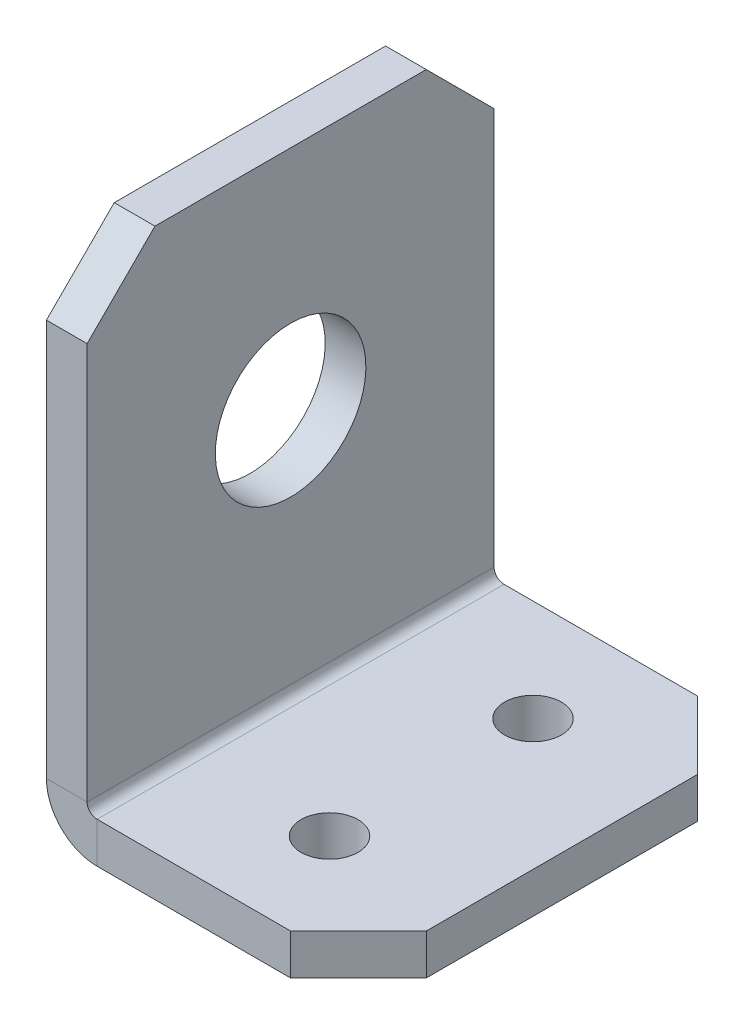
ISO-10303-21;
HEADER;
FILE_DESCRIPTION(('STEP AP214'),'2;1');
FILE_NAME('part.step','',(''),(''),'','','');
FILE_SCHEMA(('AUTOMOTIVE_DESIGN { 1 0 10303 214 1 1 1 1 }'));
ENDSEC;
DATA;
#1=APPLICATION_CONTEXT('core data for automotive mechanical design processes');
#2=APPLICATION_PROTOCOL_DEFINITION('international standard','automotive_design',2000,#1);
#3=PRODUCT_CONTEXT('',#1,'mechanical');
#4=PRODUCT('Part','Part','',(#3));
#5=PRODUCT_RELATED_PRODUCT_CATEGORY('part','',(#4));
#6=PRODUCT_DEFINITION_FORMATION('','',#4);
#7=PRODUCT_DEFINITION_CONTEXT('part definition',#1,'design');
#8=PRODUCT_DEFINITION('design','',#6,#7);
#9=PRODUCT_DEFINITION_SHAPE('','',#8);
#10=(LENGTH_UNIT() NAMED_UNIT(*) SI_UNIT(.MILLI.,.METRE.));
#11=(NAMED_UNIT(*) PLANE_ANGLE_UNIT() SI_UNIT($,.RADIAN.));
#12=(NAMED_UNIT(*) SI_UNIT($,.STERADIAN.) SOLID_ANGLE_UNIT());
#13=UNCERTAINTY_MEASURE_WITH_UNIT(LENGTH_MEASURE(1.E-05),#10,'distance_accuracy_value','');
#14=(GEOMETRIC_REPRESENTATION_CONTEXT(3) GLOBAL_UNCERTAINTY_ASSIGNED_CONTEXT((#13)) GLOBAL_UNIT_ASSIGNED_CONTEXT((#10,
#11,#12)) REPRESENTATION_CONTEXT('',''));
#15=CARTESIAN_POINT('',(0.,0.,0.));
#16=DIRECTION('',(0.,0.,1.));
#17=DIRECTION('',(1.,0.,0.));
#18=AXIS2_PLACEMENT_3D('',#15,#16,#17);
#19=CARTESIAN_POINT('',(-9.2634,-17.5,30.));
#20=DIRECTION('',(0.,0.,1.));
#21=DIRECTION('',(1.,0.,0.));
#22=AXIS2_PLACEMENT_3D('',#19,#20,#21);
#23=PLANE('',#22);
#24=DIRECTION('',(0.,-1.,0.));
#25=VECTOR('',#24,1.);
#26=CARTESIAN_POINT('',(-9.2634,-17.5,30.));
#27=LINE('',#26,#25);
#28=CARTESIAN_POINT('',(-9.2634,-17.5,30.));
#29=VERTEX_POINT('',#28);
#30=CARTESIAN_POINT('',(-9.2634,-20.5,30.));
#31=VERTEX_POINT('',#30);
#32=EDGE_CURVE('E132',#29,#31,#27,.T.);
#33=ORIENTED_EDGE('',*,*,#32,.F.);
#34=CARTESIAN_POINT('',(-9.2634,-16.7634,30.));
#35=DIRECTION('',(0.,0.,-1.));
#36=DIRECTION('',(-1.,0.,0.));
#37=AXIS2_PLACEMENT_3D('',#34,#35,#36);
#38=CIRCLE('',#37,0.7366);
#39=CARTESIAN_POINT('',(-10.,-16.7634,30.));
#40=VERTEX_POINT('',#39);
#41=EDGE_CURVE('E136',#40,#29,#38,.F.);
#42=ORIENTED_EDGE('',*,*,#41,.F.);
#43=DIRECTION('',(1.,0.,0.));
#44=VECTOR('',#43,1.);
#45=CARTESIAN_POINT('',(-13.,-16.7634,30.));
#46=LINE('',#45,#44);
#47=CARTESIAN_POINT('',(-13.,-16.7634,30.));
#48=VERTEX_POINT('',#47);
#49=EDGE_CURVE('E144',#48,#40,#46,.T.);
#50=ORIENTED_EDGE('',*,*,#49,.F.);
#51=CARTESIAN_POINT('',(-9.2634,-16.7634,30.));
#52=DIRECTION('',(0.,0.,1.));
#53=DIRECTION('',(1.,0.,0.));
#54=AXIS2_PLACEMENT_3D('',#51,#52,#53);
#55=CIRCLE('',#54,3.7366);
#56=EDGE_CURVE('E138',#48,#31,#55,.T.);
#57=ORIENTED_EDGE('',*,*,#56,.T.);
#58=EDGE_LOOP('',(#33,#42,#50,#57));
#59=FACE_BOUND('',#58,.T.);
#60=ADVANCED_FACE('F41',(#59),#23,.T.);
#61=CARTESIAN_POINT('',(-13.,-16.7634,30.));
#62=DIRECTION('',(0.,0.,1.));
#63=DIRECTION('',(1.,0.,0.));
#64=AXIS2_PLACEMENT_3D('',#61,#62,#63);
#65=PLANE('',#64);
#66=DIRECTION('',(1.,0.,0.));
#67=VECTOR('',#66,1.);
#68=CARTESIAN_POINT('',(-10.,-20.5,30.));
#69=LINE('',#68,#67);
#70=CARTESIAN_POINT('',(4.99999999999997,-20.5,30.));
#71=VERTEX_POINT('',#70);
#72=EDGE_CURVE('E166',#31,#71,#69,.T.);
#73=ORIENTED_EDGE('',*,*,#72,.T.);
#74=DIRECTION('',(0.,1.,0.));
#75=VECTOR('',#74,1.);
#76=CARTESIAN_POINT('',(4.99999999999997,-16.7634,30.));
#77=LINE('',#76,#75);
#78=CARTESIAN_POINT('',(4.99999999999997,-17.5,30.));
#79=VERTEX_POINT('',#78);
#80=EDGE_CURVE('E165',#71,#79,#77,.T.);
#81=ORIENTED_EDGE('',*,*,#80,.T.);
#82=DIRECTION('',(1.,0.,0.));
#83=VECTOR('',#82,1.);
#84=CARTESIAN_POINT('',(-10.,-17.5,30.));
#85=LINE('',#84,#83);
#86=EDGE_CURVE('E153',#29,#79,#85,.T.);
#87=ORIENTED_EDGE('',*,*,#86,.F.);
#88=ORIENTED_EDGE('',*,*,#32,.T.);
#89=EDGE_LOOP('',(#73,#81,#87,#88));
#90=FACE_BOUND('',#89,.T.);
#91=ADVANCED_FACE('F163',(#90),#65,.T.);
#92=CARTESIAN_POINT('',(-10.,-16.7634,0.));
#93=DIRECTION('',(0.,0.,-1.));
#94=DIRECTION('',(-1.,0.,0.));
#95=AXIS2_PLACEMENT_3D('',#92,#93,#94);
#96=PLANE('',#95);
#97=DIRECTION('',(-1.,0.,0.));
#98=VECTOR('',#97,1.);
#99=CARTESIAN_POINT('',(-10.,-16.7634,0.));
#100=LINE('',#99,#98);
#101=CARTESIAN_POINT('',(-10.,-16.7634,0.));
#102=VERTEX_POINT('',#101);
#103=CARTESIAN_POINT('',(-13.,-16.7634,0.));
#104=VERTEX_POINT('',#103);
#105=EDGE_CURVE('E210',#102,#104,#100,.T.);
#106=ORIENTED_EDGE('',*,*,#105,.F.);
#107=CARTESIAN_POINT('',(-9.2634,-16.7634,0.));
#108=DIRECTION('',(0.,0.,-1.));
#109=DIRECTION('',(-1.,0.,0.));
#110=AXIS2_PLACEMENT_3D('',#107,#108,#109);
#111=CIRCLE('',#110,0.7366);
#112=CARTESIAN_POINT('',(-9.2634,-17.5,0.));
#113=VERTEX_POINT('',#112);
#114=EDGE_CURVE('E185',#102,#113,#111,.F.);
#115=ORIENTED_EDGE('',*,*,#114,.T.);
#116=DIRECTION('',(0.,1.,0.));
#117=VECTOR('',#116,1.);
#118=CARTESIAN_POINT('',(-9.2634,-20.5,0.));
#119=LINE('',#118,#117);
#120=CARTESIAN_POINT('',(-9.2634,-20.5,0.));
#121=VERTEX_POINT('',#120);
#122=EDGE_CURVE('E208',#121,#113,#119,.T.);
#123=ORIENTED_EDGE('',*,*,#122,.F.);
#124=CARTESIAN_POINT('',(-9.2634,-16.7634,0.));
#125=DIRECTION('',(0.,0.,1.));
#126=DIRECTION('',(1.,0.,0.));
#127=AXIS2_PLACEMENT_3D('',#124,#125,#126);
#128=CIRCLE('',#127,3.7366);
#129=EDGE_CURVE('E191',#104,#121,#128,.T.);
#130=ORIENTED_EDGE('',*,*,#129,.F.);
#131=EDGE_LOOP('',(#106,#115,#123,#130));
#132=FACE_BOUND('',#131,.T.);
#133=ADVANCED_FACE('F315',(#132),#96,.T.);
#134=CARTESIAN_POINT('',(-9.2634,-20.5,0.));
#135=DIRECTION('',(0.,0.,-1.));
#136=DIRECTION('',(-1.,0.,0.));
#137=AXIS2_PLACEMENT_3D('',#134,#135,#136);
#138=PLANE('',#137);
#139=DIRECTION('',(0.,-1.,0.));
#140=VECTOR('',#139,1.);
#141=CARTESIAN_POINT('',(-13.,17.5,0.));
#142=LINE('',#141,#140);
#143=CARTESIAN_POINT('',(-13.,12.5,0.));
#144=VERTEX_POINT('',#143);
#145=EDGE_CURVE('E189',#144,#104,#142,.T.);
#146=ORIENTED_EDGE('',*,*,#145,.F.);
#147=DIRECTION('',(1.,0.,0.));
#148=VECTOR('',#147,1.);
#149=CARTESIAN_POINT('',(-9.2634,12.5,0.));
#150=LINE('',#149,#148);
#151=CARTESIAN_POINT('',(-10.,12.5,0.));
#152=VERTEX_POINT('',#151);
#153=EDGE_CURVE('E231',#144,#152,#150,.T.);
#154=ORIENTED_EDGE('',*,*,#153,.T.);
#155=DIRECTION('',(0.,-1.,0.));
#156=VECTOR('',#155,1.);
#157=CARTESIAN_POINT('',(-10.,17.5,0.));
#158=LINE('',#157,#156);
#159=EDGE_CURVE('E187',#152,#102,#158,.T.);
#160=ORIENTED_EDGE('',*,*,#159,.T.);
#161=ORIENTED_EDGE('',*,*,#105,.T.);
#162=EDGE_LOOP('',(#146,#154,#160,#161));
#163=FACE_BOUND('',#162,.T.);
#164=ADVANCED_FACE('F251',(#163),#138,.T.);
#165=CARTESIAN_POINT('',(-10.,-20.5,30.));
#166=DIRECTION('',(0.,1.,0.));
#167=DIRECTION('',(0.,0.,1.));
#168=AXIS2_PLACEMENT_3D('',#165,#166,#167);
#169=PLANE('',#168);
#170=CARTESIAN_POINT('',(0.3683,-20.5,22.5));
#171=DIRECTION('',(0.,1.,0.));
#172=DIRECTION('',(0.,0.,1.));
#173=AXIS2_PLACEMENT_3D('',#170,#171,#172);
#174=CIRCLE('',#173,2.1);
#175=CARTESIAN_POINT('',(0.3683,-20.5,24.6));
#176=VERTEX_POINT('',#175);
#177=EDGE_CURVE('E277',#176,#176,#174,.F.);
#178=ORIENTED_EDGE('',*,*,#177,.F.);
#179=EDGE_LOOP('',(#178));
#180=FACE_BOUND('',#179,.T.);
#181=CARTESIAN_POINT('',(0.3683,-20.5,7.5));
#182=DIRECTION('',(0.,1.,0.));
#183=DIRECTION('',(0.,0.,1.));
#184=AXIS2_PLACEMENT_3D('',#181,#182,#183);
#185=CIRCLE('',#184,2.1);
#186=CARTESIAN_POINT('',(0.3683,-20.5,9.6));
#187=VERTEX_POINT('',#186);
#188=EDGE_CURVE('E278',#187,#187,#185,.F.);
#189=ORIENTED_EDGE('',*,*,#188,.F.);
#190=EDGE_LOOP('',(#189));
#191=FACE_BOUND('',#190,.T.);
#192=DIRECTION('',(1.,0.,0.));
#193=VECTOR('',#192,1.);
#194=CARTESIAN_POINT('',(-10.,-20.5,0.));
#195=LINE('',#194,#193);
#196=CARTESIAN_POINT('',(4.99999999999999,-20.5,0.));
#197=VERTEX_POINT('',#196);
#198=EDGE_CURVE('E180',#121,#197,#195,.T.);
#199=ORIENTED_EDGE('',*,*,#198,.T.);
#200=DIRECTION('',(-0.707106781186547,0.,-0.707106781186549));
#201=VECTOR('',#200,1.);
#202=CARTESIAN_POINT('',(4.99999999999999,-20.5,0.));
#203=LINE('',#202,#201);
#204=CARTESIAN_POINT('',(10.,-20.5,5.00000000000002));
#205=VERTEX_POINT('',#204);
#206=EDGE_CURVE('E219',#197,#205,#203,.F.);
#207=ORIENTED_EDGE('',*,*,#206,.T.);
#208=DIRECTION('',(0.,0.,-1.));
#209=VECTOR('',#208,1.);
#210=CARTESIAN_POINT('',(10.,-20.5,30.));
#211=LINE('',#210,#209);
#212=CARTESIAN_POINT('',(10.,-20.5,25.));
#213=VERTEX_POINT('',#212);
#214=EDGE_CURVE('E205',#213,#205,#211,.T.);
#215=ORIENTED_EDGE('',*,*,#214,.F.);
#216=DIRECTION('',(0.707106781186549,0.,-0.707106781186547));
#217=VECTOR('',#216,1.);
#218=CARTESIAN_POINT('',(10.,-20.5,25.));
#219=LINE('',#218,#217);
#220=EDGE_CURVE('E217',#213,#71,#219,.F.);
#221=ORIENTED_EDGE('',*,*,#220,.T.);
#222=ORIENTED_EDGE('',*,*,#72,.F.);
#223=DIRECTION('',(0.,0.,-1.));
#224=VECTOR('',#223,1.);
#225=CARTESIAN_POINT('',(-9.2634,-20.5,30.));
#226=LINE('',#225,#224);
#227=EDGE_CURVE('E179',#31,#121,#226,.T.);
#228=ORIENTED_EDGE('',*,*,#227,.T.);
#229=EDGE_LOOP('',(#199,#207,#215,#221,#222,#228));
#230=FACE_BOUND('',#229,.T.);
#231=ADVANCED_FACE('F269',(#180,#191,#230),#169,.F.);
#232=CARTESIAN_POINT('',(10.,-17.5,30.));
#233=DIRECTION('',(1.,0.,0.));
#234=DIRECTION('',(0.,0.,-1.));
#235=AXIS2_PLACEMENT_3D('',#232,#233,#234);
#236=PLANE('',#235);
#237=ORIENTED_EDGE('',*,*,#214,.T.);
#238=DIRECTION('',(0.,1.,0.));
#239=VECTOR('',#238,1.);
#240=CARTESIAN_POINT('',(10.,-17.5,5.00000000000002));
#241=LINE('',#240,#239);
#242=CARTESIAN_POINT('',(10.,-17.5,5.00000000000002));
#243=VERTEX_POINT('',#242);
#244=EDGE_CURVE('E224',#205,#243,#241,.T.);
#245=ORIENTED_EDGE('',*,*,#244,.T.);
#246=DIRECTION('',(0.,0.,-1.));
#247=VECTOR('',#246,1.);
#248=CARTESIAN_POINT('',(10.,-17.5,30.));
#249=LINE('',#248,#247);
#250=CARTESIAN_POINT('',(10.,-17.5,25.));
#251=VERTEX_POINT('',#250);
#252=EDGE_CURVE('E160',#251,#243,#249,.T.);
#253=ORIENTED_EDGE('',*,*,#252,.F.);
#254=DIRECTION('',(0.,-1.,0.));
#255=VECTOR('',#254,1.);
#256=CARTESIAN_POINT('',(10.,-17.5,25.));
#257=LINE('',#256,#255);
#258=EDGE_CURVE('E221',#251,#213,#257,.T.);
#259=ORIENTED_EDGE('',*,*,#258,.T.);
#260=EDGE_LOOP('',(#237,#245,#253,#259));
#261=FACE_BOUND('',#260,.T.);
#262=ADVANCED_FACE('F295',(#261),#236,.T.);
#263=CARTESIAN_POINT('',(-10.,-17.5,30.));
#264=DIRECTION('',(0.,1.,0.));
#265=DIRECTION('',(0.,0.,1.));
#266=AXIS2_PLACEMENT_3D('',#263,#264,#265);
#267=PLANE('',#266);
#268=CARTESIAN_POINT('',(0.3683,-17.5,22.5));
#269=DIRECTION('',(0.,1.,0.));
#270=DIRECTION('',(0.,0.,1.));
#271=AXIS2_PLACEMENT_3D('',#268,#269,#270);
#272=CIRCLE('',#271,2.1);
#273=CARTESIAN_POINT('',(0.3683,-17.5,24.6));
#274=VERTEX_POINT('',#273);
#275=EDGE_CURVE('E281',#274,#274,#272,.T.);
#276=ORIENTED_EDGE('',*,*,#275,.F.);
#277=EDGE_LOOP('',(#276));
#278=FACE_BOUND('',#277,.T.);
#279=CARTESIAN_POINT('',(0.3683,-17.5,7.5));
#280=DIRECTION('',(0.,1.,0.));
#281=DIRECTION('',(0.,0.,1.));
#282=AXIS2_PLACEMENT_3D('',#279,#280,#281);
#283=CIRCLE('',#282,2.1);
#284=CARTESIAN_POINT('',(0.3683,-17.5,9.6));
#285=VERTEX_POINT('',#284);
#286=EDGE_CURVE('E282',#285,#285,#283,.T.);
#287=ORIENTED_EDGE('',*,*,#286,.F.);
#288=EDGE_LOOP('',(#287));
#289=FACE_BOUND('',#288,.T.);
#290=ORIENTED_EDGE('',*,*,#252,.T.);
#291=DIRECTION('',(0.707106781186547,0.,0.707106781186549));
#292=VECTOR('',#291,1.);
#293=CARTESIAN_POINT('',(12.5,-17.5,7.50000000000004));
#294=LINE('',#293,#292);
#295=CARTESIAN_POINT('',(4.99999999999999,-17.5,0.));
#296=VERTEX_POINT('',#295);
#297=EDGE_CURVE('E228',#243,#296,#294,.F.);
#298=ORIENTED_EDGE('',*,*,#297,.T.);
#299=DIRECTION('',(1.,0.,0.));
#300=VECTOR('',#299,1.);
#301=CARTESIAN_POINT('',(-10.,-17.5,0.));
#302=LINE('',#301,#300);
#303=EDGE_CURVE('E156',#113,#296,#302,.T.);
#304=ORIENTED_EDGE('',*,*,#303,.F.);
#305=DIRECTION('',(0.,0.,-1.));
#306=VECTOR('',#305,1.);
#307=CARTESIAN_POINT('',(-9.2634,-17.5,30.));
#308=LINE('',#307,#306);
#309=EDGE_CURVE('E150',#29,#113,#308,.T.);
#310=ORIENTED_EDGE('',*,*,#309,.F.);
#311=ORIENTED_EDGE('',*,*,#86,.T.);
#312=DIRECTION('',(-0.707106781186549,0.,0.707106781186547));
#313=VECTOR('',#312,1.);
#314=CARTESIAN_POINT('',(-2.50000000000004,-17.5,37.5));
#315=LINE('',#314,#313);
#316=EDGE_CURVE('E226',#79,#251,#315,.F.);
#317=ORIENTED_EDGE('',*,*,#316,.T.);
#318=EDGE_LOOP('',(#290,#298,#304,#310,#311,#317));
#319=FACE_BOUND('',#318,.T.);
#320=ADVANCED_FACE('F152',(#278,#289,#319),#267,.T.);
#321=CARTESIAN_POINT('',(-9.2634,-16.7634,30.));
#322=DIRECTION('',(0.,0.,-1.));
#323=DIRECTION('',(-1.,0.,0.));
#324=AXIS2_PLACEMENT_3D('',#321,#322,#323);
#325=CYLINDRICAL_SURFACE('',#324,0.7366);
#326=ORIENTED_EDGE('',*,*,#114,.F.);
#327=DIRECTION('',(0.,0.,-1.));
#328=VECTOR('',#327,1.);
#329=CARTESIAN_POINT('',(-10.,-16.7634,30.));
#330=LINE('',#329,#328);
#331=EDGE_CURVE('E161',#40,#102,#330,.T.);
#332=ORIENTED_EDGE('',*,*,#331,.F.);
#333=ORIENTED_EDGE('',*,*,#41,.T.);
#334=ORIENTED_EDGE('',*,*,#309,.T.);
#335=EDGE_LOOP('',(#326,#332,#333,#334));
#336=FACE_BOUND('',#335,.T.);
#337=ADVANCED_FACE('F169',(#336),#325,.F.);
#338=CARTESIAN_POINT('',(-10.,17.5,30.));
#339=DIRECTION('',(1.,0.,0.));
#340=DIRECTION('',(0.,1.,0.));
#341=AXIS2_PLACEMENT_3D('',#338,#339,#340);
#342=PLANE('',#341);
#343=CARTESIAN_POINT('',(-10.,0.75,15.));
#344=DIRECTION('',(1.,0.,0.));
#345=DIRECTION('',(0.,1.,0.));
#346=AXIS2_PLACEMENT_3D('',#343,#344,#345);
#347=CIRCLE('',#346,5.55);
#348=CARTESIAN_POINT('',(-10.,6.3,15.));
#349=VERTEX_POINT('',#348);
#350=EDGE_CURVE('E274',#349,#349,#347,.T.);
#351=ORIENTED_EDGE('',*,*,#350,.F.);
#352=EDGE_LOOP('',(#351));
#353=FACE_BOUND('',#352,.T.);
#354=ORIENTED_EDGE('',*,*,#159,.F.);
#355=DIRECTION('',(0.,-0.707106781186546,-0.707106781186549));
#356=VECTOR('',#355,1.);
#357=CARTESIAN_POINT('',(-10.,30.,17.5000000000001));
#358=LINE('',#357,#356);
#359=CARTESIAN_POINT('',(-10.,17.5,5.00000000000002));
#360=VERTEX_POINT('',#359);
#361=EDGE_CURVE('E236',#152,#360,#358,.F.);
#362=ORIENTED_EDGE('',*,*,#361,.T.);
#363=DIRECTION('',(0.,0.,-1.));
#364=VECTOR('',#363,1.);
#365=CARTESIAN_POINT('',(-10.,17.5,30.));
#366=LINE('',#365,#364);
#367=CARTESIAN_POINT('',(-10.,17.5,25.));
#368=VERTEX_POINT('',#367);
#369=EDGE_CURVE('E201',#368,#360,#366,.T.);
#370=ORIENTED_EDGE('',*,*,#369,.F.);
#371=DIRECTION('',(0.,-0.707106781186549,0.707106781186547));
#372=VECTOR('',#371,1.);
#373=CARTESIAN_POINT('',(-10.,15.,27.5));
#374=LINE('',#373,#372);
#375=CARTESIAN_POINT('',(-10.,12.5,30.));
#376=VERTEX_POINT('',#375);
#377=EDGE_CURVE('E234',#368,#376,#374,.T.);
#378=ORIENTED_EDGE('',*,*,#377,.T.);
#379=DIRECTION('',(0.,-1.,0.));
#380=VECTOR('',#379,1.);
#381=CARTESIAN_POINT('',(-10.,17.5,30.));
#382=LINE('',#381,#380);
#383=EDGE_CURVE('E171',#376,#40,#382,.T.);
#384=ORIENTED_EDGE('',*,*,#383,.T.);
#385=ORIENTED_EDGE('',*,*,#331,.T.);
#386=EDGE_LOOP('',(#354,#362,#370,#378,#384,#385));
#387=FACE_BOUND('',#386,.T.);
#388=ADVANCED_FACE('F257',(#353,#387),#342,.T.);
#389=CARTESIAN_POINT('',(-13.,17.5,30.));
#390=DIRECTION('',(0.,1.,0.));
#391=DIRECTION('',(0.,0.,1.));
#392=AXIS2_PLACEMENT_3D('',#389,#390,#391);
#393=PLANE('',#392);
#394=ORIENTED_EDGE('',*,*,#369,.T.);
#395=DIRECTION('',(-1.,0.,0.));
#396=VECTOR('',#395,1.);
#397=CARTESIAN_POINT('',(-13.,17.5,5.00000000000002));
#398=LINE('',#397,#396);
#399=CARTESIAN_POINT('',(-13.,17.5,5.00000000000002));
#400=VERTEX_POINT('',#399);
#401=EDGE_CURVE('E63',#360,#400,#398,.T.);
#402=ORIENTED_EDGE('',*,*,#401,.T.);
#403=DIRECTION('',(0.,0.,-1.));
#404=VECTOR('',#403,1.);
#405=CARTESIAN_POINT('',(-13.,17.5,30.));
#406=LINE('',#405,#404);
#407=CARTESIAN_POINT('',(-13.,17.5,25.));
#408=VERTEX_POINT('',#407);
#409=EDGE_CURVE('E199',#408,#400,#406,.T.);
#410=ORIENTED_EDGE('',*,*,#409,.F.);
#411=DIRECTION('',(1.,0.,0.));
#412=VECTOR('',#411,1.);
#413=CARTESIAN_POINT('',(-10.,17.5,25.));
#414=LINE('',#413,#412);
#415=EDGE_CURVE('E238',#408,#368,#414,.T.);
#416=ORIENTED_EDGE('',*,*,#415,.T.);
#417=EDGE_LOOP('',(#394,#402,#410,#416));
#418=FACE_BOUND('',#417,.T.);
#419=ADVANCED_FACE('F258',(#418),#393,.T.);
#420=CARTESIAN_POINT('',(-13.,17.5,30.));
#421=DIRECTION('',(1.,0.,0.));
#422=DIRECTION('',(0.,1.,0.));
#423=AXIS2_PLACEMENT_3D('',#420,#421,#422);
#424=PLANE('',#423);
#425=CARTESIAN_POINT('',(-13.,0.75,15.));
#426=DIRECTION('',(1.,0.,0.));
#427=DIRECTION('',(0.,1.,0.));
#428=AXIS2_PLACEMENT_3D('',#425,#426,#427);
#429=CIRCLE('',#428,5.55);
#430=CARTESIAN_POINT('',(-13.,6.3,15.));
#431=VERTEX_POINT('',#430);
#432=EDGE_CURVE('E183',#431,#431,#429,.F.);
#433=ORIENTED_EDGE('',*,*,#432,.F.);
#434=EDGE_LOOP('',(#433));
#435=FACE_BOUND('',#434,.T.);
#436=ORIENTED_EDGE('',*,*,#409,.T.);
#437=DIRECTION('',(0.,0.707106781186546,0.707106781186549));
#438=VECTOR('',#437,1.);
#439=CARTESIAN_POINT('',(-13.,12.5,0.));
#440=LINE('',#439,#438);
#441=EDGE_CURVE('E50',#400,#144,#440,.F.);
#442=ORIENTED_EDGE('',*,*,#441,.T.);
#443=ORIENTED_EDGE('',*,*,#145,.T.);
#444=DIRECTION('',(0.,0.,-1.));
#445=VECTOR('',#444,1.);
#446=CARTESIAN_POINT('',(-13.,-16.7634,30.));
#447=LINE('',#446,#445);
#448=EDGE_CURVE('E196',#48,#104,#447,.T.);
#449=ORIENTED_EDGE('',*,*,#448,.F.);
#450=DIRECTION('',(0.,-1.,0.));
#451=VECTOR('',#450,1.);
#452=CARTESIAN_POINT('',(-13.,17.5,30.));
#453=LINE('',#452,#451);
#454=CARTESIAN_POINT('',(-13.,12.5,30.));
#455=VERTEX_POINT('',#454);
#456=EDGE_CURVE('E173',#455,#48,#453,.T.);
#457=ORIENTED_EDGE('',*,*,#456,.F.);
#458=DIRECTION('',(0.,0.707106781186549,-0.707106781186547));
#459=VECTOR('',#458,1.);
#460=CARTESIAN_POINT('',(-13.,17.5,25.));
#461=LINE('',#460,#459);
#462=EDGE_CURVE('E242',#455,#408,#461,.T.);
#463=ORIENTED_EDGE('',*,*,#462,.T.);
#464=EDGE_LOOP('',(#436,#442,#443,#449,#457,#463));
#465=FACE_BOUND('',#464,.T.);
#466=ADVANCED_FACE('F246',(#435,#465),#424,.F.);
#467=CARTESIAN_POINT('',(-9.2634,-16.7634,30.));
#468=DIRECTION('',(0.,0.,-1.));
#469=DIRECTION('',(-1.,0.,0.));
#470=AXIS2_PLACEMENT_3D('',#467,#468,#469);
#471=CYLINDRICAL_SURFACE('',#470,3.7366);
#472=ORIENTED_EDGE('',*,*,#129,.T.);
#473=ORIENTED_EDGE('',*,*,#227,.F.);
#474=ORIENTED_EDGE('',*,*,#56,.F.);
#475=ORIENTED_EDGE('',*,*,#448,.T.);
#476=EDGE_LOOP('',(#472,#473,#474,#475));
#477=FACE_BOUND('',#476,.T.);
#478=ADVANCED_FACE('F265',(#477),#471,.T.);
#479=CARTESIAN_POINT('',(-9.2634,-16.7634,30.));
#480=DIRECTION('',(0.,0.,-1.));
#481=DIRECTION('',(-1.,0.,0.));
#482=AXIS2_PLACEMENT_3D('',#479,#480,#481);
#483=PLANE('',#482);
#484=ORIENTED_EDGE('',*,*,#383,.F.);
#485=DIRECTION('',(-1.,0.,0.));
#486=VECTOR('',#485,1.);
#487=CARTESIAN_POINT('',(-13.,12.5,30.));
#488=LINE('',#487,#486);
#489=EDGE_CURVE('E11',#376,#455,#488,.T.);
#490=ORIENTED_EDGE('',*,*,#489,.T.);
#491=ORIENTED_EDGE('',*,*,#456,.T.);
#492=ORIENTED_EDGE('',*,*,#49,.T.);
#493=EDGE_LOOP('',(#484,#490,#491,#492));
#494=FACE_BOUND('',#493,.T.);
#495=ADVANCED_FACE('F262',(#494),#483,.F.);
#496=CARTESIAN_POINT('',(-9.2634,-16.7634,0.));
#497=DIRECTION('',(0.,0.,-1.));
#498=DIRECTION('',(-1.,0.,0.));
#499=AXIS2_PLACEMENT_3D('',#496,#497,#498);
#500=PLANE('',#499);
#501=ORIENTED_EDGE('',*,*,#303,.T.);
#502=DIRECTION('',(0.,-1.,0.));
#503=VECTOR('',#502,1.);
#504=CARTESIAN_POINT('',(4.99999999999999,-16.7634,0.));
#505=LINE('',#504,#503);
#506=EDGE_CURVE('E143',#296,#197,#505,.T.);
#507=ORIENTED_EDGE('',*,*,#506,.T.);
#508=ORIENTED_EDGE('',*,*,#198,.F.);
#509=ORIENTED_EDGE('',*,*,#122,.T.);
#510=EDGE_LOOP('',(#501,#507,#508,#509));
#511=FACE_BOUND('',#510,.T.);
#512=ADVANCED_FACE('F371',(#511),#500,.T.);
#513=CARTESIAN_POINT('',(-13.001,0.75,15.));
#514=DIRECTION('',(1.,0.,0.));
#515=DIRECTION('',(0.,1.,0.));
#516=AXIS2_PLACEMENT_3D('',#513,#514,#515);
#517=CYLINDRICAL_SURFACE('',#516,5.55);
#518=ORIENTED_EDGE('',*,*,#350,.T.);
#519=EDGE_LOOP('',(#518));
#520=FACE_BOUND('',#519,.T.);
#521=ORIENTED_EDGE('',*,*,#432,.T.);
#522=EDGE_LOOP('',(#521));
#523=FACE_BOUND('',#522,.T.);
#524=ADVANCED_FACE('F302',(#520,#523),#517,.F.);
#525=CARTESIAN_POINT('',(0.3683,-20.501,7.5));
#526=DIRECTION('',(0.,1.,0.));
#527=DIRECTION('',(0.,0.,1.));
#528=AXIS2_PLACEMENT_3D('',#525,#526,#527);
#529=CYLINDRICAL_SURFACE('',#528,2.1);
#530=CARTESIAN_POINT('',(0.3683,-17.5,9.6));
#531=CARTESIAN_POINT('',(0.3683,-17.53125,9.6));
#532=CARTESIAN_POINT('',(0.3683,-17.5625,9.6));
#533=CARTESIAN_POINT('',(0.3683,-17.625,9.6));
#534=CARTESIAN_POINT('',(0.3683,-17.65625,9.6));
#535=CARTESIAN_POINT('',(0.3683,-17.71875,9.6));
#536=CARTESIAN_POINT('',(0.3683,-17.75,9.6));
#537=CARTESIAN_POINT('',(0.3683,-17.8125,9.6));
#538=CARTESIAN_POINT('',(0.3683,-17.84375,9.6));
#539=CARTESIAN_POINT('',(0.3683,-17.90625,9.6));
#540=CARTESIAN_POINT('',(0.3683,-17.9375,9.6));
#541=CARTESIAN_POINT('',(0.3683,-18.,9.6));
#542=CARTESIAN_POINT('',(0.3683,-18.03125,9.6));
#543=CARTESIAN_POINT('',(0.3683,-18.09375,9.6));
#544=CARTESIAN_POINT('',(0.3683,-18.125,9.6));
#545=CARTESIAN_POINT('',(0.3683,-18.1875,9.6));
#546=CARTESIAN_POINT('',(0.3683,-18.21875,9.6));
#547=CARTESIAN_POINT('',(0.3683,-18.28125,9.6));
#548=CARTESIAN_POINT('',(0.3683,-18.3125,9.6));
#549=CARTESIAN_POINT('',(0.3683,-18.375,9.6));
#550=CARTESIAN_POINT('',(0.3683,-18.40625,9.6));
#551=CARTESIAN_POINT('',(0.3683,-18.46875,9.6));
#552=CARTESIAN_POINT('',(0.3683,-18.5,9.6));
#553=CARTESIAN_POINT('',(0.3683,-18.5625,9.6));
#554=CARTESIAN_POINT('',(0.3683,-18.59375,9.6));
#555=CARTESIAN_POINT('',(0.3683,-18.65625,9.6));
#556=CARTESIAN_POINT('',(0.3683,-18.6875,9.6));
#557=CARTESIAN_POINT('',(0.3683,-18.75,9.6));
#558=CARTESIAN_POINT('',(0.3683,-18.78125,9.6));
#559=CARTESIAN_POINT('',(0.3683,-18.84375,9.6));
#560=CARTESIAN_POINT('',(0.3683,-18.875,9.6));
#561=CARTESIAN_POINT('',(0.3683,-18.9375,9.6));
#562=CARTESIAN_POINT('',(0.3683,-18.96875,9.6));
#563=CARTESIAN_POINT('',(0.3683,-19.03125,9.6));
#564=CARTESIAN_POINT('',(0.3683,-19.0625,9.6));
#565=CARTESIAN_POINT('',(0.3683,-19.125,9.6));
#566=CARTESIAN_POINT('',(0.3683,-19.15625,9.6));
#567=CARTESIAN_POINT('',(0.3683,-19.21875,9.6));
#568=CARTESIAN_POINT('',(0.3683,-19.25,9.6));
#569=CARTESIAN_POINT('',(0.3683,-19.3125,9.6));
#570=CARTESIAN_POINT('',(0.3683,-19.34375,9.6));
#571=CARTESIAN_POINT('',(0.3683,-19.40625,9.6));
#572=CARTESIAN_POINT('',(0.3683,-19.4375,9.6));
#573=CARTESIAN_POINT('',(0.3683,-19.5,9.6));
#574=CARTESIAN_POINT('',(0.3683,-19.53125,9.6));
#575=CARTESIAN_POINT('',(0.3683,-19.59375,9.6));
#576=CARTESIAN_POINT('',(0.3683,-19.625,9.6));
#577=CARTESIAN_POINT('',(0.3683,-19.6875,9.6));
#578=CARTESIAN_POINT('',(0.3683,-19.71875,9.6));
#579=CARTESIAN_POINT('',(0.3683,-19.78125,9.6));
#580=CARTESIAN_POINT('',(0.3683,-19.8125,9.6));
#581=CARTESIAN_POINT('',(0.3683,-19.875,9.6));
#582=CARTESIAN_POINT('',(0.3683,-19.90625,9.6));
#583=CARTESIAN_POINT('',(0.3683,-19.96875,9.6));
#584=CARTESIAN_POINT('',(0.3683,-20.,9.6));
#585=CARTESIAN_POINT('',(0.3683,-20.0625,9.6));
#586=CARTESIAN_POINT('',(0.3683,-20.09375,9.6));
#587=CARTESIAN_POINT('',(0.3683,-20.15625,9.6));
#588=CARTESIAN_POINT('',(0.3683,-20.1875,9.6));
#589=CARTESIAN_POINT('',(0.3683,-20.25,9.6));
#590=CARTESIAN_POINT('',(0.3683,-20.28125,9.6));
#591=CARTESIAN_POINT('',(0.3683,-20.34375,9.6));
#592=CARTESIAN_POINT('',(0.3683,-20.375,9.6));
#593=CARTESIAN_POINT('',(0.3683,-20.4375,9.6));
#594=CARTESIAN_POINT('',(0.3683,-20.46875,9.6));
#595=CARTESIAN_POINT('',(0.3683,-20.5,9.6));
#596=B_SPLINE_CURVE_WITH_KNOTS('',3,(#530,#531,#532,#533,#534,#535,#536,#537,#538,#539,#540,
#541,#542,#543,#544,#545,#546,#547,#548,#549,#550,#551,#552,#553,#554,#555,#556,#557,#558,#559,
#560,#561,#562,#563,#564,#565,#566,#567,#568,#569,#570,#571,#572,#573,#574,#575,#576,#577,#578,
#579,#580,#581,#582,#583,#584,#585,#586,#587,#588,#589,#590,#591,#592,#593,#594,#595),
.UNSPECIFIED.,.F.,.F.,(4,2,2,2,2,2,2,2,2,2,2,2,2,2,2,2,2,2,2,2,2,2,2,2,2,2,2,2,2,2,2,2,4),(0.,
0.0937500000000001,0.1875,0.28125,0.374999999999997,0.46875,0.562499999999997,0.656249999999997,
0.749999999999997,0.843749999999997,0.937499999999997,1.03125,1.125,1.21875,1.3125,1.40625,1.5,
1.59375,1.6875,1.78125,1.875,1.96875,2.0625,2.15625,2.25,2.34375,2.4375,2.53125,2.625,2.71875,
2.8125,2.90625,3.),.UNSPECIFIED.);
#597=EDGE_CURVE('BSEAM299',#285,#187,#596,.T.);
#598=ORIENTED_EDGE('',*,*,#286,.T.);
#599=ORIENTED_EDGE('',*,*,#188,.T.);
#600=ORIENTED_EDGE('',*,*,#597,.T.);
#601=ORIENTED_EDGE('',*,*,#597,.F.);
#602=EDGE_LOOP('',(#598,#600,#599,#601));
#603=FACE_BOUND('',#602,.T.);
#604=ADVANCED_FACE('F299',(#603),#529,.F.);
#605=CARTESIAN_POINT('',(0.3683,-20.501,22.5));
#606=DIRECTION('',(0.,1.,0.));
#607=DIRECTION('',(0.,0.,1.));
#608=AXIS2_PLACEMENT_3D('',#605,#606,#607);
#609=CYLINDRICAL_SURFACE('',#608,2.1);
#610=CARTESIAN_POINT('',(0.3683,-17.5,24.6));
#611=CARTESIAN_POINT('',(0.3683,-17.53125,24.6));
#612=CARTESIAN_POINT('',(0.3683,-17.5625,24.6));
#613=CARTESIAN_POINT('',(0.3683,-17.625,24.6));
#614=CARTESIAN_POINT('',(0.3683,-17.65625,24.6));
#615=CARTESIAN_POINT('',(0.3683,-17.71875,24.6));
#616=CARTESIAN_POINT('',(0.3683,-17.75,24.6));
#617=CARTESIAN_POINT('',(0.3683,-17.8125,24.6));
#618=CARTESIAN_POINT('',(0.3683,-17.84375,24.6));
#619=CARTESIAN_POINT('',(0.3683,-17.90625,24.6));
#620=CARTESIAN_POINT('',(0.3683,-17.9375,24.6));
#621=CARTESIAN_POINT('',(0.3683,-18.,24.6));
#622=CARTESIAN_POINT('',(0.3683,-18.03125,24.6));
#623=CARTESIAN_POINT('',(0.3683,-18.09375,24.6));
#624=CARTESIAN_POINT('',(0.3683,-18.125,24.6));
#625=CARTESIAN_POINT('',(0.3683,-18.1875,24.6));
#626=CARTESIAN_POINT('',(0.3683,-18.21875,24.6));
#627=CARTESIAN_POINT('',(0.3683,-18.28125,24.6));
#628=CARTESIAN_POINT('',(0.3683,-18.3125,24.6));
#629=CARTESIAN_POINT('',(0.3683,-18.375,24.6));
#630=CARTESIAN_POINT('',(0.3683,-18.40625,24.6));
#631=CARTESIAN_POINT('',(0.3683,-18.46875,24.6));
#632=CARTESIAN_POINT('',(0.3683,-18.5,24.6));
#633=CARTESIAN_POINT('',(0.3683,-18.5625,24.6));
#634=CARTESIAN_POINT('',(0.3683,-18.59375,24.6));
#635=CARTESIAN_POINT('',(0.3683,-18.65625,24.6));
#636=CARTESIAN_POINT('',(0.3683,-18.6875,24.6));
#637=CARTESIAN_POINT('',(0.3683,-18.75,24.6));
#638=CARTESIAN_POINT('',(0.3683,-18.78125,24.6));
#639=CARTESIAN_POINT('',(0.3683,-18.84375,24.6));
#640=CARTESIAN_POINT('',(0.3683,-18.875,24.6));
#641=CARTESIAN_POINT('',(0.3683,-18.9375,24.6));
#642=CARTESIAN_POINT('',(0.3683,-18.96875,24.6));
#643=CARTESIAN_POINT('',(0.3683,-19.03125,24.6));
#644=CARTESIAN_POINT('',(0.3683,-19.0625,24.6));
#645=CARTESIAN_POINT('',(0.3683,-19.125,24.6));
#646=CARTESIAN_POINT('',(0.3683,-19.15625,24.6));
#647=CARTESIAN_POINT('',(0.3683,-19.21875,24.6));
#648=CARTESIAN_POINT('',(0.3683,-19.25,24.6));
#649=CARTESIAN_POINT('',(0.3683,-19.3125,24.6));
#650=CARTESIAN_POINT('',(0.3683,-19.34375,24.6));
#651=CARTESIAN_POINT('',(0.3683,-19.40625,24.6));
#652=CARTESIAN_POINT('',(0.3683,-19.4375,24.6));
#653=CARTESIAN_POINT('',(0.3683,-19.5,24.6));
#654=CARTESIAN_POINT('',(0.3683,-19.53125,24.6));
#655=CARTESIAN_POINT('',(0.3683,-19.59375,24.6));
#656=CARTESIAN_POINT('',(0.3683,-19.625,24.6));
#657=CARTESIAN_POINT('',(0.3683,-19.6875,24.6));
#658=CARTESIAN_POINT('',(0.3683,-19.71875,24.6));
#659=CARTESIAN_POINT('',(0.3683,-19.78125,24.6));
#660=CARTESIAN_POINT('',(0.3683,-19.8125,24.6));
#661=CARTESIAN_POINT('',(0.3683,-19.875,24.6));
#662=CARTESIAN_POINT('',(0.3683,-19.90625,24.6));
#663=CARTESIAN_POINT('',(0.3683,-19.96875,24.6));
#664=CARTESIAN_POINT('',(0.3683,-20.,24.6));
#665=CARTESIAN_POINT('',(0.3683,-20.0625,24.6));
#666=CARTESIAN_POINT('',(0.3683,-20.09375,24.6));
#667=CARTESIAN_POINT('',(0.3683,-20.15625,24.6));
#668=CARTESIAN_POINT('',(0.3683,-20.1875,24.6));
#669=CARTESIAN_POINT('',(0.3683,-20.25,24.6));
#670=CARTESIAN_POINT('',(0.3683,-20.28125,24.6));
#671=CARTESIAN_POINT('',(0.3683,-20.34375,24.6));
#672=CARTESIAN_POINT('',(0.3683,-20.375,24.6));
#673=CARTESIAN_POINT('',(0.3683,-20.4375,24.6));
#674=CARTESIAN_POINT('',(0.3683,-20.46875,24.6));
#675=CARTESIAN_POINT('',(0.3683,-20.5,24.6));
#676=B_SPLINE_CURVE_WITH_KNOTS('',3,(#610,#611,#612,#613,#614,#615,#616,#617,#618,#619,#620,
#621,#622,#623,#624,#625,#626,#627,#628,#629,#630,#631,#632,#633,#634,#635,#636,#637,#638,#639,
#640,#641,#642,#643,#644,#645,#646,#647,#648,#649,#650,#651,#652,#653,#654,#655,#656,#657,#658,
#659,#660,#661,#662,#663,#664,#665,#666,#667,#668,#669,#670,#671,#672,#673,#674,#675),
.UNSPECIFIED.,.F.,.F.,(4,2,2,2,2,2,2,2,2,2,2,2,2,2,2,2,2,2,2,2,2,2,2,2,2,2,2,2,2,2,2,2,4),(0.,
0.0937500000000001,0.1875,0.28125,0.374999999999997,0.46875,0.562499999999997,0.656249999999997,
0.749999999999997,0.843749999999997,0.937499999999997,1.03125,1.125,1.21875,1.3125,1.40625,1.5,
1.59375,1.6875,1.78125,1.875,1.96875,2.0625,2.15625,2.25,2.34375,2.4375,2.53125,2.625,2.71875,
2.8125,2.90625,3.),.UNSPECIFIED.);
#677=EDGE_CURVE('BSEAM290',#274,#176,#676,.T.);
#678=ORIENTED_EDGE('',*,*,#275,.T.);
#679=ORIENTED_EDGE('',*,*,#177,.T.);
#680=ORIENTED_EDGE('',*,*,#677,.T.);
#681=ORIENTED_EDGE('',*,*,#677,.F.);
#682=EDGE_LOOP('',(#678,#680,#679,#681));
#683=FACE_BOUND('',#682,.T.);
#684=ADVANCED_FACE('F290',(#683),#609,.F.);
#685=CARTESIAN_POINT('',(4.99999999999999,-16.7634,0.));
#686=DIRECTION('',(-0.707106781186549,0.,0.707106781186547));
#687=DIRECTION('',(0.,-1.,0.));
#688=AXIS2_PLACEMENT_3D('',#685,#686,#687);
#689=PLANE('',#688);
#690=ORIENTED_EDGE('',*,*,#297,.F.);
#691=ORIENTED_EDGE('',*,*,#244,.F.);
#692=ORIENTED_EDGE('',*,*,#206,.F.);
#693=ORIENTED_EDGE('',*,*,#506,.F.);
#694=EDGE_LOOP('',(#690,#691,#692,#693));
#695=FACE_BOUND('',#694,.T.);
#696=ADVANCED_FACE('F327',(#695),#689,.F.);
#697=CARTESIAN_POINT('',(10.,-17.5,25.));
#698=DIRECTION('',(-0.707106781186547,0.,-0.707106781186549));
#699=DIRECTION('',(0.,-1.,0.));
#700=AXIS2_PLACEMENT_3D('',#697,#698,#699);
#701=PLANE('',#700);
#702=ORIENTED_EDGE('',*,*,#316,.F.);
#703=ORIENTED_EDGE('',*,*,#80,.F.);
#704=ORIENTED_EDGE('',*,*,#220,.F.);
#705=ORIENTED_EDGE('',*,*,#258,.F.);
#706=EDGE_LOOP('',(#702,#703,#704,#705));
#707=FACE_BOUND('',#706,.T.);
#708=ADVANCED_FACE('F333',(#707),#701,.F.);
#709=CARTESIAN_POINT('',(-9.2634,12.5,0.));
#710=DIRECTION('',(0.,-0.707106781186549,0.707106781186546));
#711=DIRECTION('',(1.,0.,0.));
#712=AXIS2_PLACEMENT_3D('',#709,#710,#711);
#713=PLANE('',#712);
#714=ORIENTED_EDGE('',*,*,#441,.F.);
#715=ORIENTED_EDGE('',*,*,#401,.F.);
#716=ORIENTED_EDGE('',*,*,#361,.F.);
#717=ORIENTED_EDGE('',*,*,#153,.F.);
#718=EDGE_LOOP('',(#714,#715,#716,#717));
#719=FACE_BOUND('',#718,.T.);
#720=ADVANCED_FACE('F254',(#719),#713,.F.);
#721=CARTESIAN_POINT('',(-13.,17.5,25.));
#722=DIRECTION('',(0.,0.707106781186547,0.707106781186549));
#723=DIRECTION('',(-1.,0.,0.));
#724=AXIS2_PLACEMENT_3D('',#721,#722,#723);
#725=PLANE('',#724);
#726=ORIENTED_EDGE('',*,*,#462,.F.);
#727=ORIENTED_EDGE('',*,*,#489,.F.);
#728=ORIENTED_EDGE('',*,*,#377,.F.);
#729=ORIENTED_EDGE('',*,*,#415,.F.);
#730=EDGE_LOOP('',(#726,#727,#728,#729));
#731=FACE_BOUND('',#730,.T.);
#732=ADVANCED_FACE('F44',(#731),#725,.T.);
#733=CLOSED_SHELL('',(#60,#91,#133,#164,#231,#262,#320,#337,#388,#419,#466,#478,#495,#512,#524,
#604,#684,#696,#708,#720,#732));
#734=MANIFOLD_SOLID_BREP('B2',#733);
#735=ADVANCED_BREP_SHAPE_REPRESENTATION('',(#18,#734),#14);
#736=SHAPE_DEFINITION_REPRESENTATION(#9,#735);
ENDSEC;
END-ISO-10303-21;
